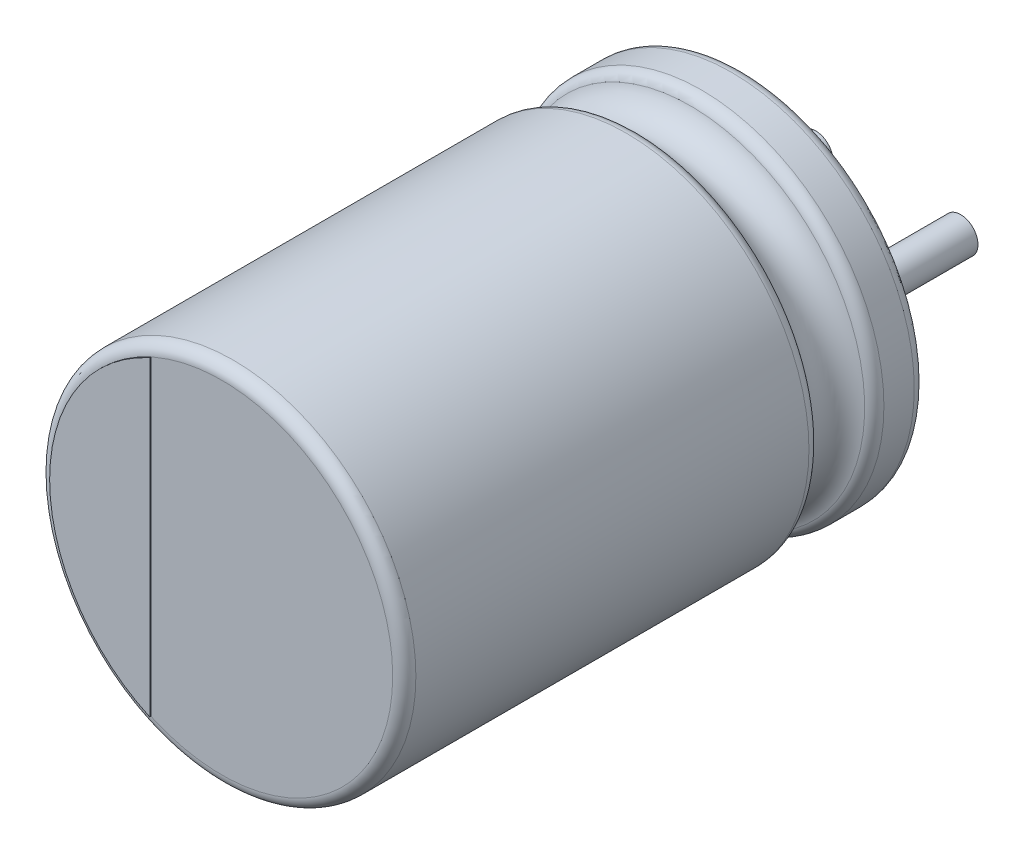
ISO-10303-21;
HEADER;
FILE_DESCRIPTION(('STEP AP214'),'2;1');
FILE_NAME('part.step','',(''),(''),'','','');
FILE_SCHEMA(('AUTOMOTIVE_DESIGN { 1 0 10303 214 1 1 1 1 }'));
ENDSEC;
DATA;
#1=APPLICATION_CONTEXT('core data for automotive mechanical design processes');
#2=APPLICATION_PROTOCOL_DEFINITION('international standard','automotive_design',2000,#1);
#3=PRODUCT_CONTEXT('',#1,'mechanical');
#4=PRODUCT('Part','Part','',(#3));
#5=PRODUCT_RELATED_PRODUCT_CATEGORY('part','',(#4));
#6=PRODUCT_DEFINITION_FORMATION('','',#4);
#7=PRODUCT_DEFINITION_CONTEXT('part definition',#1,'design');
#8=PRODUCT_DEFINITION('design','',#6,#7);
#9=PRODUCT_DEFINITION_SHAPE('','',#8);
#10=(LENGTH_UNIT() NAMED_UNIT(*) SI_UNIT(.MILLI.,.METRE.));
#11=(NAMED_UNIT(*) PLANE_ANGLE_UNIT() SI_UNIT($,.RADIAN.));
#12=(NAMED_UNIT(*) SI_UNIT($,.STERADIAN.) SOLID_ANGLE_UNIT());
#13=UNCERTAINTY_MEASURE_WITH_UNIT(LENGTH_MEASURE(1.E-05),#10,'distance_accuracy_value','');
#14=(GEOMETRIC_REPRESENTATION_CONTEXT(3) GLOBAL_UNCERTAINTY_ASSIGNED_CONTEXT((#13)) GLOBAL_UNIT_ASSIGNED_CONTEXT((#10,
#11,#12)) REPRESENTATION_CONTEXT('',''));
#15=CARTESIAN_POINT('',(0.,0.,0.));
#16=DIRECTION('',(0.,0.,1.));
#17=DIRECTION('',(1.,0.,0.));
#18=AXIS2_PLACEMENT_3D('',#15,#16,#17);
#19=CARTESIAN_POINT('',(-1.25,0.,-2.5));
#20=DIRECTION('',(0.,0.,1.));
#21=DIRECTION('',(1.,0.,0.));
#22=AXIS2_PLACEMENT_3D('',#19,#20,#21);
#23=CYLINDRICAL_SURFACE('',#22,0.3);
#24=CARTESIAN_POINT('',(-1.25,0.,-2.5));
#25=DIRECTION('',(0.,0.,1.));
#26=DIRECTION('',(-1.,0.,0.));
#27=AXIS2_PLACEMENT_3D('',#24,#25,#26);
#28=CIRCLE('',#27,0.3);
#29=CARTESIAN_POINT('',(-1.55,0.,-2.5));
#30=VERTEX_POINT('',#29);
#31=EDGE_CURVE('P0_E10',#30,#30,#28,.T.);
#32=ORIENTED_EDGE('',*,*,#31,.T.);
#33=EDGE_LOOP('',(#32));
#34=FACE_BOUND('',#33,.T.);
#35=CARTESIAN_POINT('',(-1.25,0.,0.));
#36=DIRECTION('',(0.,0.,1.));
#37=DIRECTION('',(-1.,0.,0.));
#38=AXIS2_PLACEMENT_3D('',#35,#36,#37);
#39=CIRCLE('',#38,0.3);
#40=CARTESIAN_POINT('',(-1.55,0.,0.));
#41=VERTEX_POINT('',#40);
#42=EDGE_CURVE('P0_E18',#41,#41,#39,.T.);
#43=ORIENTED_EDGE('',*,*,#42,.F.);
#44=EDGE_LOOP('',(#43));
#45=FACE_BOUND('',#44,.T.);
#46=ADVANCED_FACE('P0_F15',(#34,#45),#23,.T.);
#47=CARTESIAN_POINT('',(-1.25,0.,-2.5));
#48=DIRECTION('',(0.,0.,-1.));
#49=DIRECTION('',(-1.,0.,0.));
#50=AXIS2_PLACEMENT_3D('',#47,#48,#49);
#51=PLANE('',#50);
#52=ORIENTED_EDGE('',*,*,#31,.F.);
#53=EDGE_LOOP('',(#52));
#54=FACE_BOUND('',#53,.T.);
#55=ADVANCED_FACE('P0_F30',(#54),#51,.T.);
#56=CARTESIAN_POINT('',(-1.25,0.,0.));
#57=DIRECTION('',(0.,0.,-1.));
#58=DIRECTION('',(-1.,0.,0.));
#59=AXIS2_PLACEMENT_3D('',#56,#57,#58);
#60=PLANE('',#59);
#61=ORIENTED_EDGE('',*,*,#42,.T.);
#62=EDGE_LOOP('',(#61));
#63=FACE_BOUND('',#62,.T.);
#64=ADVANCED_FACE('P0_F27',(#63),#60,.F.);
#65=CLOSED_SHELL('',(#46,#55,#64));
#66=MANIFOLD_SOLID_BREP('P0_B1',#65);
#67=CARTESIAN_POINT('',(1.25,0.,-2.5));
#68=DIRECTION('',(0.,0.,1.));
#69=DIRECTION('',(1.,0.,0.));
#70=AXIS2_PLACEMENT_3D('',#67,#68,#69);
#71=CYLINDRICAL_SURFACE('',#70,0.3);
#72=CARTESIAN_POINT('',(1.25,0.,-2.5));
#73=DIRECTION('',(0.,0.,1.));
#74=DIRECTION('',(1.,0.,0.));
#75=AXIS2_PLACEMENT_3D('',#72,#73,#74);
#76=CIRCLE('',#75,0.3);
#77=CARTESIAN_POINT('',(1.55,0.,-2.5));
#78=VERTEX_POINT('',#77);
#79=EDGE_CURVE('P1_E10',#78,#78,#76,.T.);
#80=ORIENTED_EDGE('',*,*,#79,.T.);
#81=EDGE_LOOP('',(#80));
#82=FACE_BOUND('',#81,.T.);
#83=CARTESIAN_POINT('',(1.25,0.,0.));
#84=DIRECTION('',(0.,0.,1.));
#85=DIRECTION('',(1.,0.,0.));
#86=AXIS2_PLACEMENT_3D('',#83,#84,#85);
#87=CIRCLE('',#86,0.3);
#88=CARTESIAN_POINT('',(1.55,0.,0.));
#89=VERTEX_POINT('',#88);
#90=EDGE_CURVE('P1_E18',#89,#89,#87,.T.);
#91=ORIENTED_EDGE('',*,*,#90,.F.);
#92=EDGE_LOOP('',(#91));
#93=FACE_BOUND('',#92,.T.);
#94=ADVANCED_FACE('P1_F15',(#82,#93),#71,.T.);
#95=CARTESIAN_POINT('',(1.25,0.,-2.5));
#96=DIRECTION('',(0.,0.,1.));
#97=DIRECTION('',(1.,0.,0.));
#98=AXIS2_PLACEMENT_3D('',#95,#96,#97);
#99=PLANE('',#98);
#100=ORIENTED_EDGE('',*,*,#79,.F.);
#101=EDGE_LOOP('',(#100));
#102=FACE_BOUND('',#101,.T.);
#103=ADVANCED_FACE('P1_F30',(#102),#99,.F.);
#104=CARTESIAN_POINT('',(1.25,0.,0.));
#105=DIRECTION('',(0.,0.,1.));
#106=DIRECTION('',(1.,0.,0.));
#107=AXIS2_PLACEMENT_3D('',#104,#105,#106);
#108=PLANE('',#107);
#109=ORIENTED_EDGE('',*,*,#90,.T.);
#110=EDGE_LOOP('',(#109));
#111=FACE_BOUND('',#110,.T.);
#112=ADVANCED_FACE('P1_F27',(#111),#108,.T.);
#113=CLOSED_SHELL('',(#94,#103,#112));
#114=MANIFOLD_SOLID_BREP('P1_B1',#113);
#115=CARTESIAN_POINT('',(0.,0.,9.));
#116=DIRECTION('',(0.,0.,1.));
#117=DIRECTION('',(1.,0.,0.));
#118=AXIS2_PLACEMENT_3D('',#115,#116,#117);
#119=PLANE('',#118);
#120=CARTESIAN_POINT('',(0.,0.,9.));
#121=DIRECTION('',(0.,0.,-1.));
#122=DIRECTION('',(-1.,0.,0.));
#123=AXIS2_PLACEMENT_3D('',#120,#121,#122);
#124=CIRCLE('',#123,2.95);
#125=CARTESIAN_POINT('',(-2.95,0.,9.));
#126=VERTEX_POINT('',#125);
#127=EDGE_CURVE('P2_E9',#126,#126,#124,.T.);
#128=ORIENTED_EDGE('',*,*,#127,.F.);
#129=EDGE_LOOP('',(#128));
#130=FACE_BOUND('',#129,.T.);
#131=ADVANCED_FACE('P2_F14',(#130),#119,.T.);
#132=CARTESIAN_POINT('',(0.,0.,8.8));
#133=DIRECTION('',(0.,0.,-1.));
#134=DIRECTION('',(-1.,0.,0.));
#135=AXIS2_PLACEMENT_3D('',#132,#133,#134);
#136=TOROIDAL_SURFACE('',#135,2.95,0.200000000000001);
#137=ORIENTED_EDGE('',*,*,#127,.T.);
#138=EDGE_LOOP('',(#137));
#139=FACE_BOUND('',#138,.T.);
#140=CARTESIAN_POINT('',(0.,0.,8.8));
#141=DIRECTION('',(0.,0.,-1.));
#142=DIRECTION('',(-1.,0.,0.));
#143=AXIS2_PLACEMENT_3D('',#140,#141,#142);
#144=CIRCLE('',#143,3.15);
#145=CARTESIAN_POINT('',(-3.15,0.,8.8));
#146=VERTEX_POINT('',#145);
#147=EDGE_CURVE('P2_E20',#146,#146,#144,.T.);
#148=ORIENTED_EDGE('',*,*,#147,.F.);
#149=EDGE_LOOP('',(#148));
#150=FACE_BOUND('',#149,.T.);
#151=ADVANCED_FACE('P2_F65',(#139,#150),#136,.T.);
#152=CARTESIAN_POINT('',(0.,0.,0.));
#153=DIRECTION('',(0.,0.,-1.));
#154=DIRECTION('',(-1.,0.,0.));
#155=AXIS2_PLACEMENT_3D('',#152,#153,#154);
#156=CYLINDRICAL_SURFACE('',#155,3.15);
#157=ORIENTED_EDGE('',*,*,#147,.T.);
#158=EDGE_LOOP('',(#157));
#159=FACE_BOUND('',#158,.T.);
#160=CARTESIAN_POINT('',(0.,0.,2.01727304928868));
#161=DIRECTION('',(0.,0.,-1.));
#162=DIRECTION('',(-1.,0.,0.));
#163=AXIS2_PLACEMENT_3D('',#160,#161,#162);
#164=CIRCLE('',#163,3.15);
#165=CARTESIAN_POINT('',(-3.15,0.,2.01727304928868));
#166=VERTEX_POINT('',#165);
#167=EDGE_CURVE('P2_E24',#166,#166,#164,.T.);
#168=ORIENTED_EDGE('',*,*,#167,.F.);
#169=EDGE_LOOP('',(#168));
#170=FACE_BOUND('',#169,.T.);
#171=ADVANCED_FACE('P2_F71',(#159,#170),#156,.T.);
#172=CARTESIAN_POINT('',(0.,0.,2.01727304928868));
#173=DIRECTION('',(0.,0.,-1.));
#174=DIRECTION('',(-1.,0.,0.));
#175=AXIS2_PLACEMENT_3D('',#172,#173,#174);
#176=TOROIDAL_SURFACE('',#175,2.95,0.2);
#177=ORIENTED_EDGE('',*,*,#167,.T.);
#178=EDGE_LOOP('',(#177));
#179=FACE_BOUND('',#178,.T.);
#180=CARTESIAN_POINT('',(0.,0.,1.82619677081843));
#181=DIRECTION('',(0.,0.,-1.));
#182=DIRECTION('',(-1.,0.,0.));
#183=AXIS2_PLACEMENT_3D('',#180,#181,#182);
#184=CIRCLE('',#183,3.00907500153159);
#185=CARTESIAN_POINT('',(-3.00907500153159,0.,1.82619677081843));
#186=VERTEX_POINT('',#185);
#187=EDGE_CURVE('P2_E28',#186,#186,#184,.T.);
#188=ORIENTED_EDGE('',*,*,#187,.F.);
#189=EDGE_LOOP('',(#188));
#190=FACE_BOUND('',#189,.T.);
#191=ADVANCED_FACE('P2_F76',(#179,#190),#176,.T.);
#192=CARTESIAN_POINT('',(0.,0.,1.37037919057903));
#193=DIRECTION('',(0.,0.,-1.));
#194=DIRECTION('',(-1.,0.,0.));
#195=AXIS2_PLACEMENT_3D('',#192,#193,#194);
#196=TOROIDAL_SURFACE('',#195,3.15,0.477105356969109);
#197=ORIENTED_EDGE('',*,*,#187,.T.);
#198=EDGE_LOOP('',(#197));
#199=FACE_BOUND('',#198,.T.);
#200=CARTESIAN_POINT('',(0.,0.,0.914561610339631));
#201=DIRECTION('',(0.,0.,-1.));
#202=DIRECTION('',(-1.,0.,0.));
#203=AXIS2_PLACEMENT_3D('',#200,#201,#202);
#204=CIRCLE('',#203,3.00907500153159);
#205=CARTESIAN_POINT('',(-3.00907500153159,0.,0.914561610339631));
#206=VERTEX_POINT('',#205);
#207=EDGE_CURVE('P2_E33',#206,#206,#204,.T.);
#208=ORIENTED_EDGE('',*,*,#207,.F.);
#209=EDGE_LOOP('',(#208));
#210=FACE_BOUND('',#209,.T.);
#211=ADVANCED_FACE('P2_F82',(#199,#210),#196,.F.);
#212=CARTESIAN_POINT('',(0.,0.,0.723485331869376));
#213=DIRECTION('',(0.,0.,-1.));
#214=DIRECTION('',(-1.,0.,0.));
#215=AXIS2_PLACEMENT_3D('',#212,#213,#214);
#216=TOROIDAL_SURFACE('',#215,2.95,0.2);
#217=ORIENTED_EDGE('',*,*,#207,.T.);
#218=EDGE_LOOP('',(#217));
#219=FACE_BOUND('',#218,.T.);
#220=CARTESIAN_POINT('',(0.,0.,0.723485331869376));
#221=DIRECTION('',(0.,0.,-1.));
#222=DIRECTION('',(-1.,0.,0.));
#223=AXIS2_PLACEMENT_3D('',#220,#221,#222);
#224=CIRCLE('',#223,3.15);
#225=CARTESIAN_POINT('',(-3.15,0.,0.723485331869376));
#226=VERTEX_POINT('',#225);
#227=EDGE_CURVE('P2_E36',#226,#226,#224,.T.);
#228=ORIENTED_EDGE('',*,*,#227,.F.);
#229=EDGE_LOOP('',(#228));
#230=FACE_BOUND('',#229,.T.);
#231=ADVANCED_FACE('P2_F61',(#219,#230),#216,.T.);
#232=CARTESIAN_POINT('',(0.,0.,0.));
#233=DIRECTION('',(0.,0.,-1.));
#234=DIRECTION('',(-1.,0.,0.));
#235=AXIS2_PLACEMENT_3D('',#232,#233,#234);
#236=CYLINDRICAL_SURFACE('',#235,3.15);
#237=ORIENTED_EDGE('',*,*,#227,.T.);
#238=EDGE_LOOP('',(#237));
#239=FACE_BOUND('',#238,.T.);
#240=CARTESIAN_POINT('',(0.,0.,0.2));
#241=DIRECTION('',(0.,0.,-1.));
#242=DIRECTION('',(-1.,0.,0.));
#243=AXIS2_PLACEMENT_3D('',#240,#241,#242);
#244=CIRCLE('',#243,3.15);
#245=CARTESIAN_POINT('',(-3.15,0.,0.2));
#246=VERTEX_POINT('',#245);
#247=EDGE_CURVE('P2_E39',#246,#246,#244,.T.);
#248=ORIENTED_EDGE('',*,*,#247,.F.);
#249=EDGE_LOOP('',(#248));
#250=FACE_BOUND('',#249,.T.);
#251=ADVANCED_FACE('P2_F50',(#239,#250),#236,.T.);
#252=CARTESIAN_POINT('',(0.,0.,0.2));
#253=DIRECTION('',(0.,0.,-1.));
#254=DIRECTION('',(-1.,0.,0.));
#255=AXIS2_PLACEMENT_3D('',#252,#253,#254);
#256=TOROIDAL_SURFACE('',#255,2.95,0.2);
#257=ORIENTED_EDGE('',*,*,#247,.T.);
#258=EDGE_LOOP('',(#257));
#259=FACE_BOUND('',#258,.T.);
#260=CARTESIAN_POINT('',(0.,0.,0.));
#261=DIRECTION('',(0.,0.,-1.));
#262=DIRECTION('',(-1.,0.,0.));
#263=AXIS2_PLACEMENT_3D('',#260,#261,#262);
#264=CIRCLE('',#263,2.95);
#265=CARTESIAN_POINT('',(-2.95,0.,0.));
#266=VERTEX_POINT('',#265);
#267=EDGE_CURVE('P2_E42',#266,#266,#264,.T.);
#268=ORIENTED_EDGE('',*,*,#267,.F.);
#269=EDGE_LOOP('',(#268));
#270=FACE_BOUND('',#269,.T.);
#271=ADVANCED_FACE('P2_F48',(#259,#270),#256,.T.);
#272=CARTESIAN_POINT('',(0.,0.,0.));
#273=DIRECTION('',(0.,0.,-1.));
#274=DIRECTION('',(-1.,0.,0.));
#275=AXIS2_PLACEMENT_3D('',#272,#273,#274);
#276=PLANE('',#275);
#277=ORIENTED_EDGE('',*,*,#267,.T.);
#278=EDGE_LOOP('',(#277));
#279=FACE_BOUND('',#278,.T.);
#280=ADVANCED_FACE('P2_F46',(#279),#276,.T.);
#281=CLOSED_SHELL('',(#131,#151,#171,#191,#211,#231,#251,#271,#280));
#282=MANIFOLD_SOLID_BREP('P2_B1',#281);
#283=CARTESIAN_POINT('',(0.,0.,9.02));
#284=DIRECTION('',(0.,0.,-1.));
#285=DIRECTION('',(-1.,0.,0.));
#286=AXIS2_PLACEMENT_3D('',#283,#284,#285);
#287=CYLINDRICAL_SURFACE('',#286,2.95);
#288=CARTESIAN_POINT('',(0.,0.,9.));
#289=DIRECTION('',(0.,0.,1.));
#290=DIRECTION('',(1.,0.,0.));
#291=AXIS2_PLACEMENT_3D('',#288,#289,#290);
#292=CIRCLE('',#291,2.95);
#293=CARTESIAN_POINT('',(-1.22242400319062,2.68480531071127,9.));
#294=VERTEX_POINT('',#293);
#295=CARTESIAN_POINT('',(-1.22242400319062,-2.68480531071127,9.));
#296=VERTEX_POINT('',#295);
#297=EDGE_CURVE('P3_E47',#294,#296,#292,.T.);
#298=ORIENTED_EDGE('',*,*,#297,.T.);
#299=DIRECTION('',(0.,0.,-1.));
#300=VECTOR('',#299,1.);
#301=CARTESIAN_POINT('',(-1.22242400319062,-2.68480531071127,9.02));
#302=LINE('',#301,#300);
#303=CARTESIAN_POINT('',(-1.22242400319062,-2.68480531071127,9.02));
#304=VERTEX_POINT('',#303);
#305=EDGE_CURVE('P3_E10',#304,#296,#302,.T.);
#306=ORIENTED_EDGE('',*,*,#305,.F.);
#307=CARTESIAN_POINT('',(0.,0.,9.02));
#308=DIRECTION('',(0.,0.,1.));
#309=DIRECTION('',(1.,0.,0.));
#310=AXIS2_PLACEMENT_3D('',#307,#308,#309);
#311=CIRCLE('',#310,2.95);
#312=CARTESIAN_POINT('',(-1.22242400319062,2.68480531071127,9.02));
#313=VERTEX_POINT('',#312);
#314=EDGE_CURVE('P3_E46',#313,#304,#311,.T.);
#315=ORIENTED_EDGE('',*,*,#314,.F.);
#316=DIRECTION('',(0.,0.,-1.));
#317=VECTOR('',#316,1.);
#318=CARTESIAN_POINT('',(-1.22242400319062,2.68480531071127,9.02));
#319=LINE('',#318,#317);
#320=EDGE_CURVE('P3_E24',#313,#294,#319,.T.);
#321=ORIENTED_EDGE('',*,*,#320,.T.);
#322=EDGE_LOOP('',(#298,#306,#315,#321));
#323=FACE_BOUND('',#322,.T.);
#324=ADVANCED_FACE('P3_F16',(#323),#287,.T.);
#325=CARTESIAN_POINT('',(-1.22242400319062,2.68480531071127,9.02));
#326=DIRECTION('',(-1.,0.,0.));
#327=DIRECTION('',(0.,0.,1.));
#328=AXIS2_PLACEMENT_3D('',#325,#326,#327);
#329=PLANE('',#328);
#330=DIRECTION('',(0.,1.,0.));
#331=VECTOR('',#330,1.);
#332=CARTESIAN_POINT('',(-1.22242400319062,2.68480531071127,9.));
#333=LINE('',#332,#331);
#334=EDGE_CURVE('P3_E39',#296,#294,#333,.T.);
#335=ORIENTED_EDGE('',*,*,#334,.T.);
#336=ORIENTED_EDGE('',*,*,#320,.F.);
#337=DIRECTION('',(0.,1.,0.));
#338=VECTOR('',#337,1.);
#339=CARTESIAN_POINT('',(-1.22242400319062,2.68480531071127,9.02));
#340=LINE('',#339,#338);
#341=EDGE_CURVE('P3_E31',#304,#313,#340,.T.);
#342=ORIENTED_EDGE('',*,*,#341,.F.);
#343=ORIENTED_EDGE('',*,*,#305,.T.);
#344=EDGE_LOOP('',(#335,#336,#342,#343));
#345=FACE_BOUND('',#344,.T.);
#346=ADVANCED_FACE('P3_F42',(#345),#329,.F.);
#347=CARTESIAN_POINT('',(0.,0.,9.02));
#348=DIRECTION('',(0.,0.,1.));
#349=DIRECTION('',(1.,0.,0.));
#350=AXIS2_PLACEMENT_3D('',#347,#348,#349);
#351=PLANE('',#350);
#352=ORIENTED_EDGE('',*,*,#314,.T.);
#353=ORIENTED_EDGE('',*,*,#341,.T.);
#354=EDGE_LOOP('',(#352,#353));
#355=FACE_BOUND('',#354,.T.);
#356=ADVANCED_FACE('P3_F54',(#355),#351,.T.);
#357=CARTESIAN_POINT('',(0.,0.,9.));
#358=DIRECTION('',(0.,0.,1.));
#359=DIRECTION('',(1.,0.,0.));
#360=AXIS2_PLACEMENT_3D('',#357,#358,#359);
#361=PLANE('',#360);
#362=ORIENTED_EDGE('',*,*,#297,.F.);
#363=ORIENTED_EDGE('',*,*,#334,.F.);
#364=EDGE_LOOP('',(#362,#363));
#365=FACE_BOUND('',#364,.T.);
#366=ADVANCED_FACE('P3_F50',(#365),#361,.F.);
#367=CLOSED_SHELL('',(#324,#346,#356,#366));
#368=MANIFOLD_SOLID_BREP('P3_B1',#367);
#369=ADVANCED_BREP_SHAPE_REPRESENTATION('',(#18,#66,#114,#282,#368),#14);
#370=SHAPE_DEFINITION_REPRESENTATION(#9,#369);
ENDSEC;
END-ISO-10303-21;
